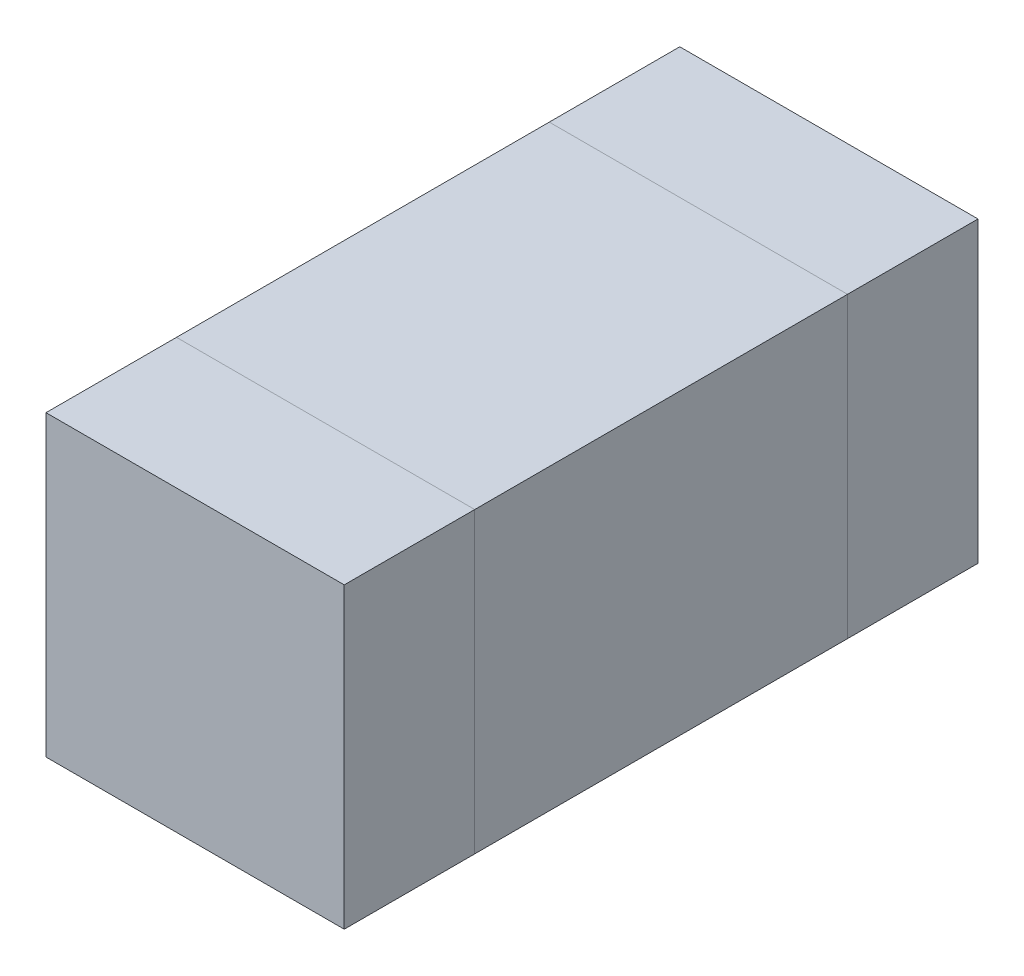
ISO-10303-21;
HEADER;
FILE_DESCRIPTION(('STEP AP214'),'2;1');
FILE_NAME('part.step','',(''),(''),'','','');
FILE_SCHEMA(('AUTOMOTIVE_DESIGN { 1 0 10303 214 1 1 1 1 }'));
ENDSEC;
DATA;
#1=APPLICATION_CONTEXT('core data for automotive mechanical design processes');
#2=APPLICATION_PROTOCOL_DEFINITION('international standard','automotive_design',2000,#1);
#3=PRODUCT_CONTEXT('',#1,'mechanical');
#4=PRODUCT('Part','Part','',(#3));
#5=PRODUCT_RELATED_PRODUCT_CATEGORY('part','',(#4));
#6=PRODUCT_DEFINITION_FORMATION('','',#4);
#7=PRODUCT_DEFINITION_CONTEXT('part definition',#1,'design');
#8=PRODUCT_DEFINITION('design','',#6,#7);
#9=PRODUCT_DEFINITION_SHAPE('','',#8);
#10=(LENGTH_UNIT() NAMED_UNIT(*) SI_UNIT(.MILLI.,.METRE.));
#11=(NAMED_UNIT(*) PLANE_ANGLE_UNIT() SI_UNIT($,.RADIAN.));
#12=(NAMED_UNIT(*) SI_UNIT($,.STERADIAN.) SOLID_ANGLE_UNIT());
#13=UNCERTAINTY_MEASURE_WITH_UNIT(LENGTH_MEASURE(1.E-05),#10,'distance_accuracy_value','');
#14=(GEOMETRIC_REPRESENTATION_CONTEXT(3) GLOBAL_UNCERTAINTY_ASSIGNED_CONTEXT((#13)) GLOBAL_UNIT_ASSIGNED_CONTEXT((#10,
#11,#12)) REPRESENTATION_CONTEXT('',''));
#15=CARTESIAN_POINT('',(0.,0.,0.));
#16=DIRECTION('',(0.,0.,1.));
#17=DIRECTION('',(1.,0.,0.));
#18=AXIS2_PLACEMENT_3D('',#15,#16,#17);
#19=CARTESIAN_POINT('',(0.4,0.8,-0.85));
#20=DIRECTION('',(-1.,0.,0.));
#21=DIRECTION('',(0.,0.,1.));
#22=AXIS2_PLACEMENT_3D('',#19,#20,#21);
#23=PLANE('',#22);
#24=DIRECTION('',(0.,-1.,0.));
#25=VECTOR('',#24,1.);
#26=CARTESIAN_POINT('',(0.4,0.8,-0.5));
#27=LINE('',#26,#25);
#28=CARTESIAN_POINT('',(0.4,0.8,-0.5));
#29=VERTEX_POINT('',#28);
#30=CARTESIAN_POINT('',(0.4,0.,-0.5));
#31=VERTEX_POINT('',#30);
#32=EDGE_CURVE('E107',#29,#31,#27,.T.);
#33=ORIENTED_EDGE('',*,*,#32,.T.);
#34=DIRECTION('',(0.,0.,1.));
#35=VECTOR('',#34,1.);
#36=CARTESIAN_POINT('',(0.4,0.,-0.85));
#37=LINE('',#36,#35);
#38=CARTESIAN_POINT('',(0.4,0.,-0.85));
#39=VERTEX_POINT('',#38);
#40=EDGE_CURVE('E12',#39,#31,#37,.T.);
#41=ORIENTED_EDGE('',*,*,#40,.F.);
#42=DIRECTION('',(0.,-1.,0.));
#43=VECTOR('',#42,1.);
#44=CARTESIAN_POINT('',(0.4,0.8,-0.85));
#45=LINE('',#44,#43);
#46=CARTESIAN_POINT('',(0.4,0.8,-0.85));
#47=VERTEX_POINT('',#46);
#48=EDGE_CURVE('E95',#47,#39,#45,.T.);
#49=ORIENTED_EDGE('',*,*,#48,.F.);
#50=DIRECTION('',(0.,0.,1.));
#51=VECTOR('',#50,1.);
#52=CARTESIAN_POINT('',(0.4,0.8,-0.85));
#53=LINE('',#52,#51);
#54=EDGE_CURVE('E103',#47,#29,#53,.T.);
#55=ORIENTED_EDGE('',*,*,#54,.T.);
#56=EDGE_LOOP('',(#33,#41,#49,#55));
#57=FACE_BOUND('',#56,.T.);
#58=ADVANCED_FACE('F44',(#57),#23,.F.);
#59=CARTESIAN_POINT('',(0.4,0.,-0.85));
#60=DIRECTION('',(0.,1.,0.));
#61=DIRECTION('',(0.,0.,1.));
#62=AXIS2_PLACEMENT_3D('',#59,#60,#61);
#63=PLANE('',#62);
#64=DIRECTION('',(-1.,0.,0.));
#65=VECTOR('',#64,1.);
#66=CARTESIAN_POINT('',(0.4,0.,-0.5));
#67=LINE('',#66,#65);
#68=CARTESIAN_POINT('',(-0.400000000000001,0.,-0.5));
#69=VERTEX_POINT('',#68);
#70=EDGE_CURVE('E99',#31,#69,#67,.T.);
#71=ORIENTED_EDGE('',*,*,#70,.T.);
#72=DIRECTION('',(0.,0.,1.));
#73=VECTOR('',#72,1.);
#74=CARTESIAN_POINT('',(-0.400000000000001,0.,-0.85));
#75=LINE('',#74,#73);
#76=CARTESIAN_POINT('',(-0.400000000000001,0.,-0.85));
#77=VERTEX_POINT('',#76);
#78=EDGE_CURVE('E52',#77,#69,#75,.T.);
#79=ORIENTED_EDGE('',*,*,#78,.F.);
#80=DIRECTION('',(-1.,0.,0.));
#81=VECTOR('',#80,1.);
#82=CARTESIAN_POINT('',(0.4,0.,-0.85));
#83=LINE('',#82,#81);
#84=EDGE_CURVE('E90',#39,#77,#83,.T.);
#85=ORIENTED_EDGE('',*,*,#84,.F.);
#86=ORIENTED_EDGE('',*,*,#40,.T.);
#87=EDGE_LOOP('',(#71,#79,#85,#86));
#88=FACE_BOUND('',#87,.T.);
#89=ADVANCED_FACE('F98',(#88),#63,.F.);
#90=CARTESIAN_POINT('',(-0.400000000000001,0.,-0.85));
#91=DIRECTION('',(1.,0.,0.));
#92=DIRECTION('',(0.,0.,-1.));
#93=AXIS2_PLACEMENT_3D('',#90,#91,#92);
#94=PLANE('',#93);
#95=DIRECTION('',(0.,1.,0.));
#96=VECTOR('',#95,1.);
#97=CARTESIAN_POINT('',(-0.400000000000001,0.,-0.5));
#98=LINE('',#97,#96);
#99=CARTESIAN_POINT('',(-0.400000000000001,0.8,-0.5));
#100=VERTEX_POINT('',#99);
#101=EDGE_CURVE('E77',#69,#100,#98,.T.);
#102=ORIENTED_EDGE('',*,*,#101,.T.);
#103=DIRECTION('',(0.,0.,1.));
#104=VECTOR('',#103,1.);
#105=CARTESIAN_POINT('',(-0.400000000000001,0.8,-0.85));
#106=LINE('',#105,#104);
#107=CARTESIAN_POINT('',(-0.400000000000001,0.8,-0.85));
#108=VERTEX_POINT('',#107);
#109=EDGE_CURVE('E100',#108,#100,#106,.T.);
#110=ORIENTED_EDGE('',*,*,#109,.F.);
#111=DIRECTION('',(0.,1.,0.));
#112=VECTOR('',#111,1.);
#113=CARTESIAN_POINT('',(-0.400000000000001,0.,-0.85));
#114=LINE('',#113,#112);
#115=EDGE_CURVE('E93',#77,#108,#114,.T.);
#116=ORIENTED_EDGE('',*,*,#115,.F.);
#117=ORIENTED_EDGE('',*,*,#78,.T.);
#118=EDGE_LOOP('',(#102,#110,#116,#117));
#119=FACE_BOUND('',#118,.T.);
#120=ADVANCED_FACE('F101',(#119),#94,.F.);
#121=CARTESIAN_POINT('',(-0.400000000000001,0.8,-0.85));
#122=DIRECTION('',(0.,-1.,0.));
#123=DIRECTION('',(0.,0.,-1.));
#124=AXIS2_PLACEMENT_3D('',#121,#122,#123);
#125=PLANE('',#124);
#126=DIRECTION('',(1.,0.,0.));
#127=VECTOR('',#126,1.);
#128=CARTESIAN_POINT('',(-0.400000000000001,0.8,-0.5));
#129=LINE('',#128,#127);
#130=EDGE_CURVE('E83',#100,#29,#129,.T.);
#131=ORIENTED_EDGE('',*,*,#130,.T.);
#132=ORIENTED_EDGE('',*,*,#54,.F.);
#133=DIRECTION('',(1.,0.,0.));
#134=VECTOR('',#133,1.);
#135=CARTESIAN_POINT('',(-0.400000000000001,0.8,-0.85));
#136=LINE('',#135,#134);
#137=EDGE_CURVE('E60',#108,#47,#136,.T.);
#138=ORIENTED_EDGE('',*,*,#137,.F.);
#139=ORIENTED_EDGE('',*,*,#109,.T.);
#140=EDGE_LOOP('',(#131,#132,#138,#139));
#141=FACE_BOUND('',#140,.T.);
#142=ADVANCED_FACE('F114',(#141),#125,.F.);
#143=CARTESIAN_POINT('',(0.,0.,-0.85));
#144=DIRECTION('',(0.,0.,-1.));
#145=DIRECTION('',(-1.,0.,0.));
#146=AXIS2_PLACEMENT_3D('',#143,#144,#145);
#147=PLANE('',#146);
#148=ORIENTED_EDGE('',*,*,#48,.T.);
#149=ORIENTED_EDGE('',*,*,#84,.T.);
#150=ORIENTED_EDGE('',*,*,#115,.T.);
#151=ORIENTED_EDGE('',*,*,#137,.T.);
#152=EDGE_LOOP('',(#148,#149,#150,#151));
#153=FACE_BOUND('',#152,.T.);
#154=ADVANCED_FACE('F91',(#153),#147,.T.);
#155=CARTESIAN_POINT('',(0.,0.,-0.5));
#156=DIRECTION('',(0.,0.,-1.));
#157=DIRECTION('',(-1.,0.,0.));
#158=AXIS2_PLACEMENT_3D('',#155,#156,#157);
#159=PLANE('',#158);
#160=ORIENTED_EDGE('',*,*,#32,.F.);
#161=ORIENTED_EDGE('',*,*,#130,.F.);
#162=ORIENTED_EDGE('',*,*,#101,.F.);
#163=ORIENTED_EDGE('',*,*,#70,.F.);
#164=EDGE_LOOP('',(#160,#161,#162,#163));
#165=FACE_BOUND('',#164,.T.);
#166=ADVANCED_FACE('F117',(#165),#159,.F.);
#167=CLOSED_SHELL('',(#58,#89,#120,#142,#154,#166));
#168=MANIFOLD_SOLID_BREP('B2',#167);
#169=CARTESIAN_POINT('',(-0.4,0.8,0.85));
#170=DIRECTION('',(1.,0.,0.));
#171=DIRECTION('',(0.,0.,-1.));
#172=AXIS2_PLACEMENT_3D('',#169,#170,#171);
#173=PLANE('',#172);
#174=DIRECTION('',(0.,-1.,0.));
#175=VECTOR('',#174,1.);
#176=CARTESIAN_POINT('',(-0.4,0.8,0.5));
#177=LINE('',#176,#175);
#178=CARTESIAN_POINT('',(-0.4,0.8,0.5));
#179=VERTEX_POINT('',#178);
#180=CARTESIAN_POINT('',(-0.4,0.,0.5));
#181=VERTEX_POINT('',#180);
#182=EDGE_CURVE('E240',#179,#181,#177,.T.);
#183=ORIENTED_EDGE('',*,*,#182,.T.);
#184=DIRECTION('',(0.,0.,-1.));
#185=VECTOR('',#184,1.);
#186=CARTESIAN_POINT('',(-0.4,0.,0.85));
#187=LINE('',#186,#185);
#188=CARTESIAN_POINT('',(-0.4,0.,0.85));
#189=VERTEX_POINT('',#188);
#190=EDGE_CURVE('E42',#189,#181,#187,.T.);
#191=ORIENTED_EDGE('',*,*,#190,.F.);
#192=DIRECTION('',(0.,-1.,0.));
#193=VECTOR('',#192,1.);
#194=CARTESIAN_POINT('',(-0.4,0.8,0.85));
#195=LINE('',#194,#193);
#196=CARTESIAN_POINT('',(-0.4,0.8,0.85));
#197=VERTEX_POINT('',#196);
#198=EDGE_CURVE('E228',#197,#189,#195,.T.);
#199=ORIENTED_EDGE('',*,*,#198,.F.);
#200=DIRECTION('',(0.,0.,-1.));
#201=VECTOR('',#200,1.);
#202=CARTESIAN_POINT('',(-0.4,0.8,0.85));
#203=LINE('',#202,#201);
#204=EDGE_CURVE('E236',#197,#179,#203,.T.);
#205=ORIENTED_EDGE('',*,*,#204,.T.);
#206=EDGE_LOOP('',(#183,#191,#199,#205));
#207=FACE_BOUND('',#206,.T.);
#208=ADVANCED_FACE('F177',(#207),#173,.F.);
#209=CARTESIAN_POINT('',(-0.4,0.,0.85));
#210=DIRECTION('',(0.,1.,0.));
#211=DIRECTION('',(0.,0.,1.));
#212=AXIS2_PLACEMENT_3D('',#209,#210,#211);
#213=PLANE('',#212);
#214=DIRECTION('',(1.,0.,0.));
#215=VECTOR('',#214,1.);
#216=CARTESIAN_POINT('',(-0.4,0.,0.5));
#217=LINE('',#216,#215);
#218=CARTESIAN_POINT('',(0.4,0.,0.5));
#219=VERTEX_POINT('',#218);
#220=EDGE_CURVE('E232',#181,#219,#217,.T.);
#221=ORIENTED_EDGE('',*,*,#220,.T.);
#222=DIRECTION('',(0.,0.,-1.));
#223=VECTOR('',#222,1.);
#224=CARTESIAN_POINT('',(0.4,0.,0.85));
#225=LINE('',#224,#223);
#226=CARTESIAN_POINT('',(0.4,0.,0.85));
#227=VERTEX_POINT('',#226);
#228=EDGE_CURVE('E185',#227,#219,#225,.T.);
#229=ORIENTED_EDGE('',*,*,#228,.F.);
#230=DIRECTION('',(1.,0.,0.));
#231=VECTOR('',#230,1.);
#232=CARTESIAN_POINT('',(-0.4,0.,0.85));
#233=LINE('',#232,#231);
#234=EDGE_CURVE('E223',#189,#227,#233,.T.);
#235=ORIENTED_EDGE('',*,*,#234,.F.);
#236=ORIENTED_EDGE('',*,*,#190,.T.);
#237=EDGE_LOOP('',(#221,#229,#235,#236));
#238=FACE_BOUND('',#237,.T.);
#239=ADVANCED_FACE('F231',(#238),#213,.F.);
#240=CARTESIAN_POINT('',(0.4,0.,0.85));
#241=DIRECTION('',(-1.,0.,0.));
#242=DIRECTION('',(0.,0.,1.));
#243=AXIS2_PLACEMENT_3D('',#240,#241,#242);
#244=PLANE('',#243);
#245=DIRECTION('',(0.,1.,0.));
#246=VECTOR('',#245,1.);
#247=CARTESIAN_POINT('',(0.4,0.,0.5));
#248=LINE('',#247,#246);
#249=CARTESIAN_POINT('',(0.4,0.8,0.5));
#250=VERTEX_POINT('',#249);
#251=EDGE_CURVE('E210',#219,#250,#248,.T.);
#252=ORIENTED_EDGE('',*,*,#251,.T.);
#253=DIRECTION('',(0.,0.,-1.));
#254=VECTOR('',#253,1.);
#255=CARTESIAN_POINT('',(0.4,0.8,0.85));
#256=LINE('',#255,#254);
#257=CARTESIAN_POINT('',(0.4,0.8,0.85));
#258=VERTEX_POINT('',#257);
#259=EDGE_CURVE('E233',#258,#250,#256,.T.);
#260=ORIENTED_EDGE('',*,*,#259,.F.);
#261=DIRECTION('',(0.,1.,0.));
#262=VECTOR('',#261,1.);
#263=CARTESIAN_POINT('',(0.4,0.,0.85));
#264=LINE('',#263,#262);
#265=EDGE_CURVE('E226',#227,#258,#264,.T.);
#266=ORIENTED_EDGE('',*,*,#265,.F.);
#267=ORIENTED_EDGE('',*,*,#228,.T.);
#268=EDGE_LOOP('',(#252,#260,#266,#267));
#269=FACE_BOUND('',#268,.T.);
#270=ADVANCED_FACE('F234',(#269),#244,.F.);
#271=CARTESIAN_POINT('',(0.4,0.8,0.85));
#272=DIRECTION('',(0.,-1.,0.));
#273=DIRECTION('',(0.,0.,-1.));
#274=AXIS2_PLACEMENT_3D('',#271,#272,#273);
#275=PLANE('',#274);
#276=DIRECTION('',(-1.,0.,0.));
#277=VECTOR('',#276,1.);
#278=CARTESIAN_POINT('',(0.4,0.8,0.5));
#279=LINE('',#278,#277);
#280=EDGE_CURVE('E216',#250,#179,#279,.T.);
#281=ORIENTED_EDGE('',*,*,#280,.T.);
#282=ORIENTED_EDGE('',*,*,#204,.F.);
#283=DIRECTION('',(-1.,0.,0.));
#284=VECTOR('',#283,1.);
#285=CARTESIAN_POINT('',(0.4,0.8,0.85));
#286=LINE('',#285,#284);
#287=EDGE_CURVE('E193',#258,#197,#286,.T.);
#288=ORIENTED_EDGE('',*,*,#287,.F.);
#289=ORIENTED_EDGE('',*,*,#259,.T.);
#290=EDGE_LOOP('',(#281,#282,#288,#289));
#291=FACE_BOUND('',#290,.T.);
#292=ADVANCED_FACE('F247',(#291),#275,.F.);
#293=CARTESIAN_POINT('',(0.,0.,0.85));
#294=DIRECTION('',(0.,0.,1.));
#295=DIRECTION('',(1.,0.,0.));
#296=AXIS2_PLACEMENT_3D('',#293,#294,#295);
#297=PLANE('',#296);
#298=ORIENTED_EDGE('',*,*,#198,.T.);
#299=ORIENTED_EDGE('',*,*,#234,.T.);
#300=ORIENTED_EDGE('',*,*,#265,.T.);
#301=ORIENTED_EDGE('',*,*,#287,.T.);
#302=EDGE_LOOP('',(#298,#299,#300,#301));
#303=FACE_BOUND('',#302,.T.);
#304=ADVANCED_FACE('F224',(#303),#297,.T.);
#305=CARTESIAN_POINT('',(0.,0.,0.5));
#306=DIRECTION('',(0.,0.,1.));
#307=DIRECTION('',(1.,0.,0.));
#308=AXIS2_PLACEMENT_3D('',#305,#306,#307);
#309=PLANE('',#308);
#310=ORIENTED_EDGE('',*,*,#182,.F.);
#311=ORIENTED_EDGE('',*,*,#280,.F.);
#312=ORIENTED_EDGE('',*,*,#251,.F.);
#313=ORIENTED_EDGE('',*,*,#220,.F.);
#314=EDGE_LOOP('',(#310,#311,#312,#313));
#315=FACE_BOUND('',#314,.T.);
#316=ADVANCED_FACE('F250',(#315),#309,.F.);
#317=CLOSED_SHELL('',(#208,#239,#270,#292,#304,#316));
#318=MANIFOLD_SOLID_BREP('B6',#317);
#319=CARTESIAN_POINT('',(0.4,0.8,-0.5));
#320=DIRECTION('',(-1.,0.,0.));
#321=DIRECTION('',(0.,0.,1.));
#322=AXIS2_PLACEMENT_3D('',#319,#320,#321);
#323=PLANE('',#322);
#324=DIRECTION('',(0.,0.,-1.));
#325=VECTOR('',#324,1.);
#326=CARTESIAN_POINT('',(0.4,0.,-0.5));
#327=LINE('',#326,#325);
#328=CARTESIAN_POINT('',(0.4,0.,0.5));
#329=VERTEX_POINT('',#328);
#330=CARTESIAN_POINT('',(0.4,0.,-0.5));
#331=VERTEX_POINT('',#330);
#332=EDGE_CURVE('E364',#329,#331,#327,.T.);
#333=ORIENTED_EDGE('',*,*,#332,.T.);
#334=DIRECTION('',(0.,-1.,0.));
#335=VECTOR('',#334,1.);
#336=CARTESIAN_POINT('',(0.4,0.8,-0.5));
#337=LINE('',#336,#335);
#338=CARTESIAN_POINT('',(0.4,0.8,-0.5));
#339=VERTEX_POINT('',#338);
#340=EDGE_CURVE('E175',#339,#331,#337,.T.);
#341=ORIENTED_EDGE('',*,*,#340,.F.);
#342=DIRECTION('',(0.,0.,-1.));
#343=VECTOR('',#342,1.);
#344=CARTESIAN_POINT('',(0.4,0.8,-0.5));
#345=LINE('',#344,#343);
#346=CARTESIAN_POINT('',(0.4,0.8,0.5));
#347=VERTEX_POINT('',#346);
#348=EDGE_CURVE('E352',#347,#339,#345,.T.);
#349=ORIENTED_EDGE('',*,*,#348,.F.);
#350=DIRECTION('',(0.,-1.,0.));
#351=VECTOR('',#350,1.);
#352=CARTESIAN_POINT('',(0.4,0.8,0.5));
#353=LINE('',#352,#351);
#354=EDGE_CURVE('E360',#347,#329,#353,.T.);
#355=ORIENTED_EDGE('',*,*,#354,.T.);
#356=EDGE_LOOP('',(#333,#341,#349,#355));
#357=FACE_BOUND('',#356,.T.);
#358=ADVANCED_FACE('F301',(#357),#323,.F.);
#359=CARTESIAN_POINT('',(-0.400000000000001,0.8,-0.5));
#360=DIRECTION('',(0.,0.,1.));
#361=DIRECTION('',(1.,0.,0.));
#362=AXIS2_PLACEMENT_3D('',#359,#360,#361);
#363=PLANE('',#362);
#364=DIRECTION('',(-1.,0.,0.));
#365=VECTOR('',#364,1.);
#366=CARTESIAN_POINT('',(-0.400000000000001,0.,-0.5));
#367=LINE('',#366,#365);
#368=CARTESIAN_POINT('',(-0.400000000000001,0.,-0.5));
#369=VERTEX_POINT('',#368);
#370=EDGE_CURVE('E356',#331,#369,#367,.T.);
#371=ORIENTED_EDGE('',*,*,#370,.T.);
#372=DIRECTION('',(0.,-1.,0.));
#373=VECTOR('',#372,1.);
#374=CARTESIAN_POINT('',(-0.400000000000001,0.8,-0.5));
#375=LINE('',#374,#373);
#376=CARTESIAN_POINT('',(-0.400000000000001,0.8,-0.5));
#377=VERTEX_POINT('',#376);
#378=EDGE_CURVE('E309',#377,#369,#375,.T.);
#379=ORIENTED_EDGE('',*,*,#378,.F.);
#380=DIRECTION('',(-1.,0.,0.));
#381=VECTOR('',#380,1.);
#382=CARTESIAN_POINT('',(-0.400000000000001,0.8,-0.5));
#383=LINE('',#382,#381);
#384=EDGE_CURVE('E347',#339,#377,#383,.T.);
#385=ORIENTED_EDGE('',*,*,#384,.F.);
#386=ORIENTED_EDGE('',*,*,#340,.T.);
#387=EDGE_LOOP('',(#371,#379,#385,#386));
#388=FACE_BOUND('',#387,.T.);
#389=ADVANCED_FACE('F355',(#388),#363,.F.);
#390=CARTESIAN_POINT('',(-0.400000000000001,0.8,-0.5));
#391=DIRECTION('',(1.,0.,0.));
#392=DIRECTION('',(0.,0.,-1.));
#393=AXIS2_PLACEMENT_3D('',#390,#391,#392);
#394=PLANE('',#393);
#395=DIRECTION('',(0.,0.,1.));
#396=VECTOR('',#395,1.);
#397=CARTESIAN_POINT('',(-0.400000000000001,0.,-0.5));
#398=LINE('',#397,#396);
#399=CARTESIAN_POINT('',(-0.4,0.,0.5));
#400=VERTEX_POINT('',#399);
#401=EDGE_CURVE('E334',#369,#400,#398,.T.);
#402=ORIENTED_EDGE('',*,*,#401,.T.);
#403=DIRECTION('',(0.,-1.,0.));
#404=VECTOR('',#403,1.);
#405=CARTESIAN_POINT('',(-0.4,0.8,0.5));
#406=LINE('',#405,#404);
#407=CARTESIAN_POINT('',(-0.4,0.8,0.5));
#408=VERTEX_POINT('',#407);
#409=EDGE_CURVE('E357',#408,#400,#406,.T.);
#410=ORIENTED_EDGE('',*,*,#409,.F.);
#411=DIRECTION('',(0.,0.,1.));
#412=VECTOR('',#411,1.);
#413=CARTESIAN_POINT('',(-0.400000000000001,0.8,-0.5));
#414=LINE('',#413,#412);
#415=EDGE_CURVE('E350',#377,#408,#414,.T.);
#416=ORIENTED_EDGE('',*,*,#415,.F.);
#417=ORIENTED_EDGE('',*,*,#378,.T.);
#418=EDGE_LOOP('',(#402,#410,#416,#417));
#419=FACE_BOUND('',#418,.T.);
#420=ADVANCED_FACE('F358',(#419),#394,.F.);
#421=CARTESIAN_POINT('',(-0.4,0.8,0.5));
#422=DIRECTION('',(0.,0.,-1.));
#423=DIRECTION('',(-1.,0.,0.));
#424=AXIS2_PLACEMENT_3D('',#421,#422,#423);
#425=PLANE('',#424);
#426=DIRECTION('',(1.,0.,0.));
#427=VECTOR('',#426,1.);
#428=CARTESIAN_POINT('',(-0.4,0.,0.5));
#429=LINE('',#428,#427);
#430=EDGE_CURVE('E340',#400,#329,#429,.T.);
#431=ORIENTED_EDGE('',*,*,#430,.T.);
#432=ORIENTED_EDGE('',*,*,#354,.F.);
#433=DIRECTION('',(1.,0.,0.));
#434=VECTOR('',#433,1.);
#435=CARTESIAN_POINT('',(-0.4,0.8,0.5));
#436=LINE('',#435,#434);
#437=EDGE_CURVE('E317',#408,#347,#436,.T.);
#438=ORIENTED_EDGE('',*,*,#437,.F.);
#439=ORIENTED_EDGE('',*,*,#409,.T.);
#440=EDGE_LOOP('',(#431,#432,#438,#439));
#441=FACE_BOUND('',#440,.T.);
#442=ADVANCED_FACE('F371',(#441),#425,.F.);
#443=CARTESIAN_POINT('',(0.,0.8,0.));
#444=DIRECTION('',(0.,1.,0.));
#445=DIRECTION('',(0.,0.,1.));
#446=AXIS2_PLACEMENT_3D('',#443,#444,#445);
#447=PLANE('',#446);
#448=ORIENTED_EDGE('',*,*,#348,.T.);
#449=ORIENTED_EDGE('',*,*,#384,.T.);
#450=ORIENTED_EDGE('',*,*,#415,.T.);
#451=ORIENTED_EDGE('',*,*,#437,.T.);
#452=EDGE_LOOP('',(#448,#449,#450,#451));
#453=FACE_BOUND('',#452,.T.);
#454=ADVANCED_FACE('F348',(#453),#447,.T.);
#455=CARTESIAN_POINT('',(0.,0.,0.));
#456=DIRECTION('',(0.,1.,0.));
#457=DIRECTION('',(0.,0.,1.));
#458=AXIS2_PLACEMENT_3D('',#455,#456,#457);
#459=PLANE('',#458);
#460=ORIENTED_EDGE('',*,*,#332,.F.);
#461=ORIENTED_EDGE('',*,*,#430,.F.);
#462=ORIENTED_EDGE('',*,*,#401,.F.);
#463=ORIENTED_EDGE('',*,*,#370,.F.);
#464=EDGE_LOOP('',(#460,#461,#462,#463));
#465=FACE_BOUND('',#464,.T.);
#466=ADVANCED_FACE('F374',(#465),#459,.F.);
#467=CLOSED_SHELL('',(#358,#389,#420,#442,#454,#466));
#468=MANIFOLD_SOLID_BREP('B36',#467);
#469=ADVANCED_BREP_SHAPE_REPRESENTATION('',(#18,#168,#318,#468),#14);
#470=SHAPE_DEFINITION_REPRESENTATION(#9,#469);
ENDSEC;
END-ISO-10303-21;
